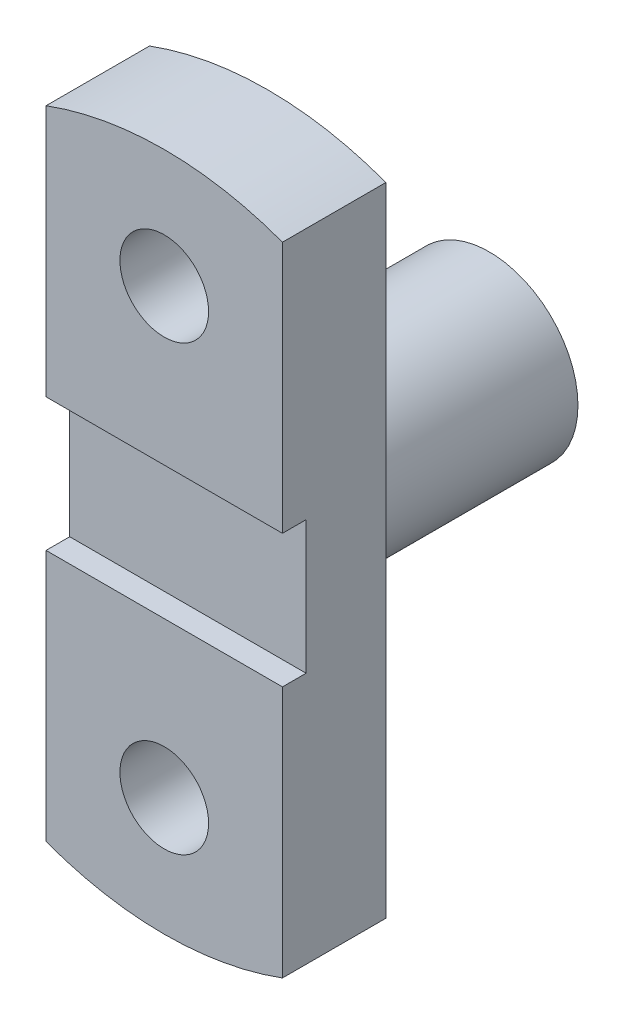
ISO-10303-21;
HEADER;
FILE_DESCRIPTION(('STEP AP214'),'2;1');
FILE_NAME('part.step','',(''),(''),'','','');
FILE_SCHEMA(('AUTOMOTIVE_DESIGN { 1 0 10303 214 1 1 1 1 }'));
ENDSEC;
DATA;
#1=APPLICATION_CONTEXT('core data for automotive mechanical design processes');
#2=APPLICATION_PROTOCOL_DEFINITION('international standard','automotive_design',2000,#1);
#3=PRODUCT_CONTEXT('',#1,'mechanical');
#4=PRODUCT('Part','Part','',(#3));
#5=PRODUCT_RELATED_PRODUCT_CATEGORY('part','',(#4));
#6=PRODUCT_DEFINITION_FORMATION('','',#4);
#7=PRODUCT_DEFINITION_CONTEXT('part definition',#1,'design');
#8=PRODUCT_DEFINITION('design','',#6,#7);
#9=PRODUCT_DEFINITION_SHAPE('','',#8);
#10=(LENGTH_UNIT() NAMED_UNIT(*) SI_UNIT(.MILLI.,.METRE.));
#11=(NAMED_UNIT(*) PLANE_ANGLE_UNIT() SI_UNIT($,.RADIAN.));
#12=(NAMED_UNIT(*) SI_UNIT($,.STERADIAN.) SOLID_ANGLE_UNIT());
#13=UNCERTAINTY_MEASURE_WITH_UNIT(LENGTH_MEASURE(1.E-05),#10,'distance_accuracy_value','');
#14=(GEOMETRIC_REPRESENTATION_CONTEXT(3) GLOBAL_UNCERTAINTY_ASSIGNED_CONTEXT((#13)) GLOBAL_UNIT_ASSIGNED_CONTEXT((#10,
#11,#12)) REPRESENTATION_CONTEXT('',''));
#15=CARTESIAN_POINT('',(0.,0.,0.));
#16=DIRECTION('',(0.,0.,1.));
#17=DIRECTION('',(1.,0.,0.));
#18=AXIS2_PLACEMENT_3D('',#15,#16,#17);
#19=CARTESIAN_POINT('',(0.,0.,35.));
#20=DIRECTION('',(0.,0.,1.));
#21=DIRECTION('',(1.,0.,0.));
#22=AXIS2_PLACEMENT_3D('',#19,#20,#21);
#23=PLANE('',#22);
#24=DIRECTION('',(1.,0.,0.));
#25=VECTOR('',#24,1.);
#26=CARTESIAN_POINT('',(-176.,22.5,35.));
#27=LINE('',#26,#25);
#28=CARTESIAN_POINT('',(-40.,22.5,35.));
#29=VERTEX_POINT('',#28);
#30=CARTESIAN_POINT('',(40.,22.5,35.));
#31=VERTEX_POINT('',#30);
#32=EDGE_CURVE('E170',#29,#31,#27,.T.);
#33=ORIENTED_EDGE('',*,*,#32,.T.);
#34=DIRECTION('',(0.,1.,0.));
#35=VECTOR('',#34,1.);
#36=CARTESIAN_POINT('',(40.,107.819293264239,35.));
#37=LINE('',#36,#35);
#38=CARTESIAN_POINT('',(40.,107.819293264239,35.));
#39=VERTEX_POINT('',#38);
#40=EDGE_CURVE('E132',#31,#39,#37,.T.);
#41=ORIENTED_EDGE('',*,*,#40,.T.);
#42=CARTESIAN_POINT('',(0.,0.,35.));
#43=DIRECTION('',(0.,0.,1.));
#44=DIRECTION('',(1.,0.,0.));
#45=AXIS2_PLACEMENT_3D('',#42,#43,#44);
#46=CIRCLE('',#45,115.);
#47=CARTESIAN_POINT('',(-40.,107.819293264239,35.));
#48=VERTEX_POINT('',#47);
#49=EDGE_CURVE('E131',#39,#48,#46,.T.);
#50=ORIENTED_EDGE('',*,*,#49,.T.);
#51=DIRECTION('',(0.,-1.,0.));
#52=VECTOR('',#51,1.);
#53=CARTESIAN_POINT('',(-40.,107.819293264239,35.));
#54=LINE('',#53,#52);
#55=EDGE_CURVE('E138',#48,#29,#54,.T.);
#56=ORIENTED_EDGE('',*,*,#55,.T.);
#57=EDGE_LOOP('',(#33,#41,#50,#56));
#58=FACE_BOUND('',#57,.T.);
#59=CARTESIAN_POINT('',(0.,75.,35.));
#60=DIRECTION('',(0.,0.,1.));
#61=DIRECTION('',(1.,0.,0.));
#62=AXIS2_PLACEMENT_3D('',#59,#60,#61);
#63=CIRCLE('',#62,15.);
#64=CARTESIAN_POINT('',(15.,75.,35.));
#65=VERTEX_POINT('',#64);
#66=EDGE_CURVE('E146',#65,#65,#63,.T.);
#67=ORIENTED_EDGE('',*,*,#66,.F.);
#68=EDGE_LOOP('',(#67));
#69=FACE_BOUND('',#68,.T.);
#70=ADVANCED_FACE('F37',(#58,#69),#23,.T.);
#71=DIRECTION('',(1.,0.,0.));
#72=VECTOR('',#71,1.);
#73=CARTESIAN_POINT('',(-176.,-22.5,35.));
#74=LINE('',#73,#72);
#75=CARTESIAN_POINT('',(-40.,-22.5,35.));
#76=VERTEX_POINT('',#75);
#77=CARTESIAN_POINT('',(40.,-22.5,35.));
#78=VERTEX_POINT('',#77);
#79=EDGE_CURVE('E111',#76,#78,#74,.T.);
#80=ORIENTED_EDGE('',*,*,#79,.F.);
#81=CARTESIAN_POINT('',(-40.,-107.819293264239,35.));
#82=VERTEX_POINT('',#81);
#83=EDGE_CURVE('E61',#76,#82,#54,.T.);
#84=ORIENTED_EDGE('',*,*,#83,.T.);
#85=CARTESIAN_POINT('',(0.,0.,35.));
#86=DIRECTION('',(0.,0.,1.));
#87=DIRECTION('',(1.,0.,0.));
#88=AXIS2_PLACEMENT_3D('',#85,#86,#87);
#89=CIRCLE('',#88,115.);
#90=CARTESIAN_POINT('',(40.,-107.819293264239,35.));
#91=VERTEX_POINT('',#90);
#92=EDGE_CURVE('E129',#82,#91,#89,.T.);
#93=ORIENTED_EDGE('',*,*,#92,.T.);
#94=EDGE_CURVE('E91',#91,#78,#37,.T.);
#95=ORIENTED_EDGE('',*,*,#94,.T.);
#96=EDGE_LOOP('',(#80,#84,#93,#95));
#97=FACE_BOUND('',#96,.T.);
#98=CARTESIAN_POINT('',(0.,-75.,35.));
#99=DIRECTION('',(0.,0.,1.));
#100=DIRECTION('',(1.,0.,0.));
#101=AXIS2_PLACEMENT_3D('',#98,#99,#100);
#102=CIRCLE('',#101,15.);
#103=CARTESIAN_POINT('',(15.,-75.,35.));
#104=VERTEX_POINT('',#103);
#105=EDGE_CURVE('E190',#104,#104,#102,.T.);
#106=ORIENTED_EDGE('',*,*,#105,.F.);
#107=EDGE_LOOP('',(#106));
#108=FACE_BOUND('',#107,.T.);
#109=ADVANCED_FACE('F126',(#97,#108),#23,.T.);
#110=CARTESIAN_POINT('',(0.,0.,0.));
#111=DIRECTION('',(0.,0.,1.));
#112=DIRECTION('',(1.,0.,0.));
#113=AXIS2_PLACEMENT_3D('',#110,#111,#112);
#114=PLANE('',#113);
#115=CARTESIAN_POINT('',(0.,0.,0.));
#116=DIRECTION('',(0.,0.,1.));
#117=DIRECTION('',(1.,0.,0.));
#118=AXIS2_PLACEMENT_3D('',#115,#116,#117);
#119=CIRCLE('',#118,30.);
#120=CARTESIAN_POINT('',(30.,0.,0.));
#121=VERTEX_POINT('',#120);
#122=EDGE_CURVE('E11',#121,#121,#119,.F.);
#123=ORIENTED_EDGE('',*,*,#122,.F.);
#124=EDGE_LOOP('',(#123));
#125=FACE_BOUND('',#124,.T.);
#126=CARTESIAN_POINT('',(0.,0.,0.));
#127=DIRECTION('',(0.,0.,1.));
#128=DIRECTION('',(1.,0.,0.));
#129=AXIS2_PLACEMENT_3D('',#126,#127,#128);
#130=CIRCLE('',#129,115.);
#131=CARTESIAN_POINT('',(-40.,-107.819293264239,0.));
#132=VERTEX_POINT('',#131);
#133=CARTESIAN_POINT('',(40.,-107.819293264239,0.));
#134=VERTEX_POINT('',#133);
#135=EDGE_CURVE('E142',#132,#134,#130,.T.);
#136=ORIENTED_EDGE('',*,*,#135,.F.);
#137=DIRECTION('',(0.,-1.,0.));
#138=VECTOR('',#137,1.);
#139=CARTESIAN_POINT('',(-40.,107.819293264239,0.));
#140=LINE('',#139,#138);
#141=CARTESIAN_POINT('',(-40.,107.819293264239,0.));
#142=VERTEX_POINT('',#141);
#143=EDGE_CURVE('E83',#142,#132,#140,.T.);
#144=ORIENTED_EDGE('',*,*,#143,.F.);
#145=CARTESIAN_POINT('',(0.,0.,0.));
#146=DIRECTION('',(0.,0.,1.));
#147=DIRECTION('',(1.,0.,0.));
#148=AXIS2_PLACEMENT_3D('',#145,#146,#147);
#149=CIRCLE('',#148,115.);
#150=CARTESIAN_POINT('',(40.,107.819293264239,0.));
#151=VERTEX_POINT('',#150);
#152=EDGE_CURVE('E148',#151,#142,#149,.T.);
#153=ORIENTED_EDGE('',*,*,#152,.F.);
#154=DIRECTION('',(0.,1.,0.));
#155=VECTOR('',#154,1.);
#156=CARTESIAN_POINT('',(40.,107.819293264239,0.));
#157=LINE('',#156,#155);
#158=EDGE_CURVE('E145',#134,#151,#157,.T.);
#159=ORIENTED_EDGE('',*,*,#158,.F.);
#160=EDGE_LOOP('',(#136,#144,#153,#159));
#161=FACE_BOUND('',#160,.T.);
#162=CARTESIAN_POINT('',(0.,75.,0.));
#163=DIRECTION('',(0.,0.,1.));
#164=DIRECTION('',(1.,0.,0.));
#165=AXIS2_PLACEMENT_3D('',#162,#163,#164);
#166=CIRCLE('',#165,15.);
#167=CARTESIAN_POINT('',(15.,75.,0.));
#168=VERTEX_POINT('',#167);
#169=EDGE_CURVE('E193',#168,#168,#166,.T.);
#170=ORIENTED_EDGE('',*,*,#169,.T.);
#171=EDGE_LOOP('',(#170));
#172=FACE_BOUND('',#171,.T.);
#173=CARTESIAN_POINT('',(0.,-75.,0.));
#174=DIRECTION('',(0.,0.,1.));
#175=DIRECTION('',(1.,0.,0.));
#176=AXIS2_PLACEMENT_3D('',#173,#174,#175);
#177=CIRCLE('',#176,15.);
#178=CARTESIAN_POINT('',(15.,-75.,0.));
#179=VERTEX_POINT('',#178);
#180=EDGE_CURVE('E186',#179,#179,#177,.T.);
#181=ORIENTED_EDGE('',*,*,#180,.T.);
#182=EDGE_LOOP('',(#181));
#183=FACE_BOUND('',#182,.T.);
#184=ADVANCED_FACE('F179',(#125,#161,#172,#183),#114,.F.);
#185=CARTESIAN_POINT('',(0.,0.,35.));
#186=DIRECTION('',(0.,0.,-1.));
#187=DIRECTION('',(-1.,0.,0.));
#188=AXIS2_PLACEMENT_3D('',#185,#186,#187);
#189=CYLINDRICAL_SURFACE('',#188,115.);
#190=ORIENTED_EDGE('',*,*,#135,.T.);
#191=DIRECTION('',(0.,0.,-1.));
#192=VECTOR('',#191,1.);
#193=CARTESIAN_POINT('',(40.,-107.819293264239,35.));
#194=LINE('',#193,#192);
#195=EDGE_CURVE('E157',#91,#134,#194,.T.);
#196=ORIENTED_EDGE('',*,*,#195,.F.);
#197=ORIENTED_EDGE('',*,*,#92,.F.);
#198=DIRECTION('',(0.,0.,-1.));
#199=VECTOR('',#198,1.);
#200=CARTESIAN_POINT('',(-40.,-107.819293264239,35.));
#201=LINE('',#200,#199);
#202=EDGE_CURVE('E141',#82,#132,#201,.T.);
#203=ORIENTED_EDGE('',*,*,#202,.T.);
#204=EDGE_LOOP('',(#190,#196,#197,#203));
#205=FACE_BOUND('',#204,.T.);
#206=ADVANCED_FACE('F39',(#205),#189,.T.);
#207=CARTESIAN_POINT('',(40.,107.819293264239,35.));
#208=DIRECTION('',(-1.,0.,0.));
#209=DIRECTION('',(0.,-1.,0.));
#210=AXIS2_PLACEMENT_3D('',#207,#208,#209);
#211=PLANE('',#210);
#212=ORIENTED_EDGE('',*,*,#40,.F.);
#213=DIRECTION('',(0.,0.,1.));
#214=VECTOR('',#213,1.);
#215=CARTESIAN_POINT('',(40.,22.5,35.));
#216=LINE('',#215,#214);
#217=CARTESIAN_POINT('',(40.,22.5,27.));
#218=VERTEX_POINT('',#217);
#219=EDGE_CURVE('E117',#218,#31,#216,.T.);
#220=ORIENTED_EDGE('',*,*,#219,.F.);
#221=DIRECTION('',(0.,1.,0.));
#222=VECTOR('',#221,1.);
#223=CARTESIAN_POINT('',(40.,22.5,27.));
#224=LINE('',#223,#222);
#225=CARTESIAN_POINT('',(40.,-22.5,27.));
#226=VERTEX_POINT('',#225);
#227=EDGE_CURVE('E123',#226,#218,#224,.T.);
#228=ORIENTED_EDGE('',*,*,#227,.F.);
#229=DIRECTION('',(0.,0.,-1.));
#230=VECTOR('',#229,1.);
#231=CARTESIAN_POINT('',(40.,-22.5,35.));
#232=LINE('',#231,#230);
#233=EDGE_CURVE('E113',#78,#226,#232,.T.);
#234=ORIENTED_EDGE('',*,*,#233,.F.);
#235=ORIENTED_EDGE('',*,*,#94,.F.);
#236=ORIENTED_EDGE('',*,*,#195,.T.);
#237=ORIENTED_EDGE('',*,*,#158,.T.);
#238=DIRECTION('',(0.,0.,-1.));
#239=VECTOR('',#238,1.);
#240=CARTESIAN_POINT('',(40.,107.819293264239,35.));
#241=LINE('',#240,#239);
#242=EDGE_CURVE('E154',#39,#151,#241,.T.);
#243=ORIENTED_EDGE('',*,*,#242,.F.);
#244=EDGE_LOOP('',(#212,#220,#228,#234,#235,#236,#237,#243));
#245=FACE_BOUND('',#244,.T.);
#246=ADVANCED_FACE('F120',(#245),#211,.F.);
#247=CARTESIAN_POINT('',(0.,0.,35.));
#248=DIRECTION('',(0.,0.,-1.));
#249=DIRECTION('',(-1.,0.,0.));
#250=AXIS2_PLACEMENT_3D('',#247,#248,#249);
#251=CYLINDRICAL_SURFACE('',#250,115.);
#252=ORIENTED_EDGE('',*,*,#152,.T.);
#253=DIRECTION('',(0.,0.,-1.));
#254=VECTOR('',#253,1.);
#255=CARTESIAN_POINT('',(-40.,107.819293264239,35.));
#256=LINE('',#255,#254);
#257=EDGE_CURVE('E152',#48,#142,#256,.T.);
#258=ORIENTED_EDGE('',*,*,#257,.F.);
#259=ORIENTED_EDGE('',*,*,#49,.F.);
#260=ORIENTED_EDGE('',*,*,#242,.T.);
#261=EDGE_LOOP('',(#252,#258,#259,#260));
#262=FACE_BOUND('',#261,.T.);
#263=ADVANCED_FACE('F175',(#262),#251,.T.);
#264=CARTESIAN_POINT('',(-40.,107.819293264239,35.));
#265=DIRECTION('',(1.,0.,0.));
#266=DIRECTION('',(0.,1.,0.));
#267=AXIS2_PLACEMENT_3D('',#264,#265,#266);
#268=PLANE('',#267);
#269=DIRECTION('',(0.,1.,0.));
#270=VECTOR('',#269,1.);
#271=CARTESIAN_POINT('',(-40.,107.819293264239,27.));
#272=LINE('',#271,#270);
#273=CARTESIAN_POINT('',(-40.,-22.5,27.));
#274=VERTEX_POINT('',#273);
#275=CARTESIAN_POINT('',(-40.,22.5,27.));
#276=VERTEX_POINT('',#275);
#277=EDGE_CURVE('E160',#274,#276,#272,.T.);
#278=ORIENTED_EDGE('',*,*,#277,.T.);
#279=DIRECTION('',(0.,0.,1.));
#280=VECTOR('',#279,1.);
#281=CARTESIAN_POINT('',(-40.,22.5,34.9999999999999));
#282=LINE('',#281,#280);
#283=EDGE_CURVE('E45',#276,#29,#282,.T.);
#284=ORIENTED_EDGE('',*,*,#283,.T.);
#285=ORIENTED_EDGE('',*,*,#55,.F.);
#286=ORIENTED_EDGE('',*,*,#257,.T.);
#287=ORIENTED_EDGE('',*,*,#143,.T.);
#288=ORIENTED_EDGE('',*,*,#202,.F.);
#289=ORIENTED_EDGE('',*,*,#83,.F.);
#290=DIRECTION('',(0.,0.,-1.));
#291=VECTOR('',#290,1.);
#292=CARTESIAN_POINT('',(-40.,-22.5,35.));
#293=LINE('',#292,#291);
#294=EDGE_CURVE('E116',#76,#274,#293,.T.);
#295=ORIENTED_EDGE('',*,*,#294,.T.);
#296=EDGE_LOOP('',(#278,#284,#285,#286,#287,#288,#289,#295));
#297=FACE_BOUND('',#296,.T.);
#298=ADVANCED_FACE('F164',(#297),#268,.F.);
#299=CARTESIAN_POINT('',(0.,75.,35.));
#300=DIRECTION('',(0.,0.,-1.));
#301=DIRECTION('',(-1.,0.,0.));
#302=AXIS2_PLACEMENT_3D('',#299,#300,#301);
#303=CYLINDRICAL_SURFACE('',#302,15.);
#304=ORIENTED_EDGE('',*,*,#66,.T.);
#305=EDGE_LOOP('',(#304));
#306=FACE_BOUND('',#305,.T.);
#307=ORIENTED_EDGE('',*,*,#169,.F.);
#308=EDGE_LOOP('',(#307));
#309=FACE_BOUND('',#308,.T.);
#310=ADVANCED_FACE('F201',(#306,#309),#303,.F.);
#311=CARTESIAN_POINT('',(0.,-75.,35.));
#312=DIRECTION('',(0.,0.,-1.));
#313=DIRECTION('',(-1.,0.,0.));
#314=AXIS2_PLACEMENT_3D('',#311,#312,#313);
#315=CYLINDRICAL_SURFACE('',#314,15.);
#316=ORIENTED_EDGE('',*,*,#105,.T.);
#317=EDGE_LOOP('',(#316));
#318=FACE_BOUND('',#317,.T.);
#319=ORIENTED_EDGE('',*,*,#180,.F.);
#320=EDGE_LOOP('',(#319));
#321=FACE_BOUND('',#320,.T.);
#322=ADVANCED_FACE('F203',(#318,#321),#315,.F.);
#323=CARTESIAN_POINT('',(-176.,22.5,35.));
#324=DIRECTION('',(0.,1.,0.));
#325=DIRECTION('',(0.,0.,1.));
#326=AXIS2_PLACEMENT_3D('',#323,#324,#325);
#327=PLANE('',#326);
#328=DIRECTION('',(1.,0.,0.));
#329=VECTOR('',#328,1.);
#330=CARTESIAN_POINT('',(-176.,22.5,27.));
#331=LINE('',#330,#329);
#332=EDGE_CURVE('E187',#276,#218,#331,.T.);
#333=ORIENTED_EDGE('',*,*,#332,.T.);
#334=ORIENTED_EDGE('',*,*,#219,.T.);
#335=ORIENTED_EDGE('',*,*,#32,.F.);
#336=ORIENTED_EDGE('',*,*,#283,.F.);
#337=EDGE_LOOP('',(#333,#334,#335,#336));
#338=FACE_BOUND('',#337,.T.);
#339=ADVANCED_FACE('F210',(#338),#327,.F.);
#340=CARTESIAN_POINT('',(-176.,22.5,27.));
#341=DIRECTION('',(0.,0.,-1.));
#342=DIRECTION('',(0.,1.,0.));
#343=AXIS2_PLACEMENT_3D('',#340,#341,#342);
#344=PLANE('',#343);
#345=DIRECTION('',(1.,0.,0.));
#346=VECTOR('',#345,1.);
#347=CARTESIAN_POINT('',(-176.,-22.5,27.));
#348=LINE('',#347,#346);
#349=EDGE_CURVE('E52',#274,#226,#348,.T.);
#350=ORIENTED_EDGE('',*,*,#349,.T.);
#351=ORIENTED_EDGE('',*,*,#227,.T.);
#352=ORIENTED_EDGE('',*,*,#332,.F.);
#353=ORIENTED_EDGE('',*,*,#277,.F.);
#354=EDGE_LOOP('',(#350,#351,#352,#353));
#355=FACE_BOUND('',#354,.T.);
#356=ADVANCED_FACE('F268',(#355),#344,.F.);
#357=CARTESIAN_POINT('',(-176.,-22.5,35.));
#358=DIRECTION('',(0.,-1.,0.));
#359=DIRECTION('',(1.,0.,0.));
#360=AXIS2_PLACEMENT_3D('',#357,#358,#359);
#361=PLANE('',#360);
#362=ORIENTED_EDGE('',*,*,#79,.T.);
#363=ORIENTED_EDGE('',*,*,#233,.T.);
#364=ORIENTED_EDGE('',*,*,#349,.F.);
#365=ORIENTED_EDGE('',*,*,#294,.F.);
#366=EDGE_LOOP('',(#362,#363,#364,#365));
#367=FACE_BOUND('',#366,.T.);
#368=ADVANCED_FACE('F112',(#367),#361,.F.);
#369=CARTESIAN_POINT('',(0.,0.,-75.));
#370=DIRECTION('',(0.,0.,1.));
#371=DIRECTION('',(1.,0.,0.));
#372=AXIS2_PLACEMENT_3D('',#369,#370,#371);
#373=CYLINDRICAL_SURFACE('',#372,30.);
#374=CARTESIAN_POINT('',(0.,0.,-75.));
#375=DIRECTION('',(0.,0.,-1.));
#376=DIRECTION('',(-1.,0.,0.));
#377=AXIS2_PLACEMENT_3D('',#374,#375,#376);
#378=CIRCLE('',#377,30.);
#379=CARTESIAN_POINT('',(-30.,0.,-75.));
#380=VERTEX_POINT('',#379);
#381=EDGE_CURVE('E124',#380,#380,#378,.T.);
#382=ORIENTED_EDGE('',*,*,#381,.F.);
#383=EDGE_LOOP('',(#382));
#384=FACE_BOUND('',#383,.T.);
#385=ORIENTED_EDGE('',*,*,#122,.T.);
#386=EDGE_LOOP('',(#385));
#387=FACE_BOUND('',#386,.T.);
#388=ADVANCED_FACE('F287',(#384,#387),#373,.T.);
#389=CARTESIAN_POINT('',(0.,0.,-75.));
#390=DIRECTION('',(0.,0.,-1.));
#391=DIRECTION('',(-1.,0.,0.));
#392=AXIS2_PLACEMENT_3D('',#389,#390,#391);
#393=PLANE('',#392);
#394=ORIENTED_EDGE('',*,*,#381,.T.);
#395=EDGE_LOOP('',(#394));
#396=FACE_BOUND('',#395,.T.);
#397=ADVANCED_FACE('F297',(#396),#393,.T.);
#398=CLOSED_SHELL('',(#70,#109,#184,#206,#246,#263,#298,#310,#322,#339,#356,#368,#388,#397));
#399=MANIFOLD_SOLID_BREP('B2',#398);
#400=ADVANCED_BREP_SHAPE_REPRESENTATION('',(#18,#399),#14);
#401=SHAPE_DEFINITION_REPRESENTATION(#9,#400);
ENDSEC;
END-ISO-10303-21;
